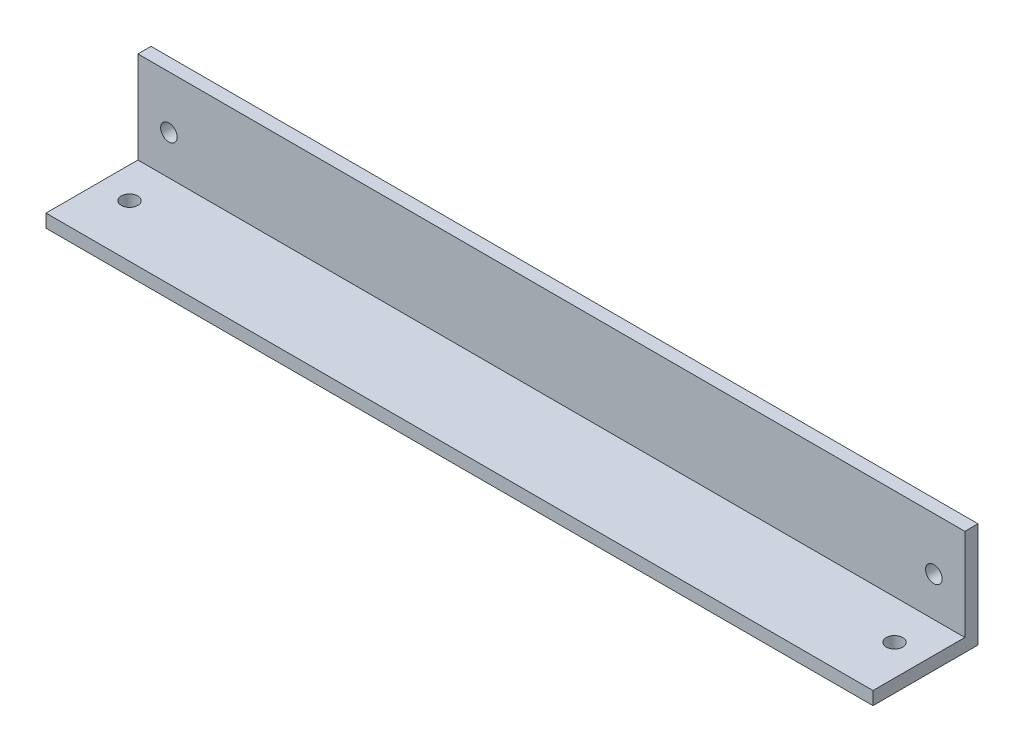
ISO-10303-21;
HEADER;
FILE_DESCRIPTION(('STEP AP214'),'2;1');
FILE_NAME('part.step','',(''),(''),'','','');
FILE_SCHEMA(('AUTOMOTIVE_DESIGN { 1 0 10303 214 1 1 1 1 }'));
ENDSEC;
DATA;
#1=APPLICATION_CONTEXT('core data for automotive mechanical design processes');
#2=APPLICATION_PROTOCOL_DEFINITION('international standard','automotive_design',2000,#1);
#3=PRODUCT_CONTEXT('',#1,'mechanical');
#4=PRODUCT('Part','Part','',(#3));
#5=PRODUCT_RELATED_PRODUCT_CATEGORY('part','',(#4));
#6=PRODUCT_DEFINITION_FORMATION('','',#4);
#7=PRODUCT_DEFINITION_CONTEXT('part definition',#1,'design');
#8=PRODUCT_DEFINITION('design','',#6,#7);
#9=PRODUCT_DEFINITION_SHAPE('','',#8);
#10=(LENGTH_UNIT() NAMED_UNIT(*) SI_UNIT(.MILLI.,.METRE.));
#11=(NAMED_UNIT(*) PLANE_ANGLE_UNIT() SI_UNIT($,.RADIAN.));
#12=(NAMED_UNIT(*) SI_UNIT($,.STERADIAN.) SOLID_ANGLE_UNIT());
#13=UNCERTAINTY_MEASURE_WITH_UNIT(LENGTH_MEASURE(1.E-05),#10,'distance_accuracy_value','');
#14=(GEOMETRIC_REPRESENTATION_CONTEXT(3) GLOBAL_UNCERTAINTY_ASSIGNED_CONTEXT((#13)) GLOBAL_UNIT_ASSIGNED_CONTEXT((#10,
#11,#12)) REPRESENTATION_CONTEXT('',''));
#15=CARTESIAN_POINT('',(0.,0.,0.));
#16=DIRECTION('',(0.,0.,1.));
#17=DIRECTION('',(1.,0.,0.));
#18=AXIS2_PLACEMENT_3D('',#15,#16,#17);
#19=CARTESIAN_POINT('',(200.,6.34999999999999,6.35));
#20=DIRECTION('',(0.,0.,-1.));
#21=DIRECTION('',(0.,1.,0.));
#22=AXIS2_PLACEMENT_3D('',#19,#20,#21);
#23=PLANE('',#22);
#24=CARTESIAN_POINT('',(-185.,25.4,6.35));
#25=DIRECTION('',(0.,0.,-1.));
#26=DIRECTION('',(0.,1.,0.));
#27=AXIS2_PLACEMENT_3D('',#24,#25,#26);
#28=CIRCLE('',#27,3.99999999999999);
#29=CARTESIAN_POINT('',(-185.,29.4,6.35));
#30=VERTEX_POINT('',#29);
#31=EDGE_CURVE('E150',#30,#30,#28,.T.);
#32=ORIENTED_EDGE('',*,*,#31,.T.);
#33=EDGE_LOOP('',(#32));
#34=FACE_BOUND('',#33,.T.);
#35=DIRECTION('',(0.,-1.,0.));
#36=VECTOR('',#35,1.);
#37=CARTESIAN_POINT('',(-200.,6.34999999999999,6.35));
#38=LINE('',#37,#36);
#39=CARTESIAN_POINT('',(-200.,50.8,6.35));
#40=VERTEX_POINT('',#39);
#41=CARTESIAN_POINT('',(-200.,6.34999999999999,6.35));
#42=VERTEX_POINT('',#41);
#43=EDGE_CURVE('E120',#40,#42,#38,.T.);
#44=ORIENTED_EDGE('',*,*,#43,.T.);
#45=DIRECTION('',(-1.,0.,0.));
#46=VECTOR('',#45,1.);
#47=CARTESIAN_POINT('',(200.,6.34999999999999,6.35));
#48=LINE('',#47,#46);
#49=CARTESIAN_POINT('',(200.,6.34999999999999,6.35));
#50=VERTEX_POINT('',#49);
#51=EDGE_CURVE('E41',#50,#42,#48,.T.);
#52=ORIENTED_EDGE('',*,*,#51,.F.);
#53=DIRECTION('',(0.,-1.,0.));
#54=VECTOR('',#53,1.);
#55=CARTESIAN_POINT('',(200.,6.34999999999999,6.35));
#56=LINE('',#55,#54);
#57=CARTESIAN_POINT('',(200.,50.8,6.35));
#58=VERTEX_POINT('',#57);
#59=EDGE_CURVE('E86',#58,#50,#56,.T.);
#60=ORIENTED_EDGE('',*,*,#59,.F.);
#61=DIRECTION('',(-1.,0.,0.));
#62=VECTOR('',#61,1.);
#63=CARTESIAN_POINT('',(200.,50.8,6.35));
#64=LINE('',#63,#62);
#65=EDGE_CURVE('E11',#58,#40,#64,.T.);
#66=ORIENTED_EDGE('',*,*,#65,.T.);
#67=EDGE_LOOP('',(#44,#52,#60,#66));
#68=FACE_BOUND('',#67,.T.);
#69=CARTESIAN_POINT('',(185.,25.4,6.35));
#70=DIRECTION('',(0.,0.,-1.));
#71=DIRECTION('',(0.,1.,0.));
#72=AXIS2_PLACEMENT_3D('',#69,#70,#71);
#73=CIRCLE('',#72,3.99999999999999);
#74=CARTESIAN_POINT('',(185.,29.4,6.35));
#75=VERTEX_POINT('',#74);
#76=EDGE_CURVE('E151',#75,#75,#73,.T.);
#77=ORIENTED_EDGE('',*,*,#76,.T.);
#78=EDGE_LOOP('',(#77));
#79=FACE_BOUND('',#78,.T.);
#80=ADVANCED_FACE('F32',(#34,#68,#79),#23,.F.);
#81=CARTESIAN_POINT('',(200.,50.8,0.));
#82=DIRECTION('',(0.,0.,1.));
#83=DIRECTION('',(1.,0.,0.));
#84=AXIS2_PLACEMENT_3D('',#81,#82,#83);
#85=PLANE('',#84);
#86=CARTESIAN_POINT('',(-185.,25.4,0.));
#87=DIRECTION('',(0.,0.,1.));
#88=DIRECTION('',(0.,-1.,0.));
#89=AXIS2_PLACEMENT_3D('',#86,#87,#88);
#90=CIRCLE('',#89,3.99999999999999);
#91=CARTESIAN_POINT('',(-185.,21.4,0.));
#92=VERTEX_POINT('',#91);
#93=EDGE_CURVE('E154',#92,#92,#90,.T.);
#94=ORIENTED_EDGE('',*,*,#93,.T.);
#95=EDGE_LOOP('',(#94));
#96=FACE_BOUND('',#95,.T.);
#97=DIRECTION('',(0.,1.,0.));
#98=VECTOR('',#97,1.);
#99=CARTESIAN_POINT('',(-200.,50.8,0.));
#100=LINE('',#99,#98);
#101=CARTESIAN_POINT('',(-200.,0.,0.));
#102=VERTEX_POINT('',#101);
#103=CARTESIAN_POINT('',(-200.,50.8,0.));
#104=VERTEX_POINT('',#103);
#105=EDGE_CURVE('E78',#102,#104,#100,.T.);
#106=ORIENTED_EDGE('',*,*,#105,.T.);
#107=DIRECTION('',(-1.,0.,0.));
#108=VECTOR('',#107,1.);
#109=CARTESIAN_POINT('',(200.,50.8,0.));
#110=LINE('',#109,#108);
#111=CARTESIAN_POINT('',(200.,50.8,0.));
#112=VERTEX_POINT('',#111);
#113=EDGE_CURVE('E113',#112,#104,#110,.T.);
#114=ORIENTED_EDGE('',*,*,#113,.F.);
#115=DIRECTION('',(0.,1.,0.));
#116=VECTOR('',#115,1.);
#117=CARTESIAN_POINT('',(200.,50.8,0.));
#118=LINE('',#117,#116);
#119=CARTESIAN_POINT('',(200.,0.,0.));
#120=VERTEX_POINT('',#119);
#121=EDGE_CURVE('E49',#120,#112,#118,.T.);
#122=ORIENTED_EDGE('',*,*,#121,.F.);
#123=DIRECTION('',(-1.,0.,0.));
#124=VECTOR('',#123,1.);
#125=CARTESIAN_POINT('',(200.,0.,0.));
#126=LINE('',#125,#124);
#127=EDGE_CURVE('E109',#120,#102,#126,.T.);
#128=ORIENTED_EDGE('',*,*,#127,.T.);
#129=EDGE_LOOP('',(#106,#114,#122,#128));
#130=FACE_BOUND('',#129,.T.);
#131=CARTESIAN_POINT('',(185.,25.4,0.));
#132=DIRECTION('',(0.,0.,1.));
#133=DIRECTION('',(0.,1.,0.));
#134=AXIS2_PLACEMENT_3D('',#131,#132,#133);
#135=CIRCLE('',#134,3.99999999999999);
#136=CARTESIAN_POINT('',(185.,29.4,0.));
#137=VERTEX_POINT('',#136);
#138=EDGE_CURVE('E148',#137,#137,#135,.T.);
#139=ORIENTED_EDGE('',*,*,#138,.T.);
#140=EDGE_LOOP('',(#139));
#141=FACE_BOUND('',#140,.T.);
#142=ADVANCED_FACE('F141',(#96,#130,#141),#85,.F.);
#143=CARTESIAN_POINT('',(200.,50.8,6.35));
#144=DIRECTION('',(0.,-1.,0.));
#145=DIRECTION('',(0.,0.,-1.));
#146=AXIS2_PLACEMENT_3D('',#143,#144,#145);
#147=PLANE('',#146);
#148=DIRECTION('',(0.,0.,1.));
#149=VECTOR('',#148,1.);
#150=CARTESIAN_POINT('',(-200.,50.8,6.35));
#151=LINE('',#150,#149);
#152=EDGE_CURVE('E117',#104,#40,#151,.T.);
#153=ORIENTED_EDGE('',*,*,#152,.T.);
#154=ORIENTED_EDGE('',*,*,#65,.F.);
#155=DIRECTION('',(0.,0.,1.));
#156=VECTOR('',#155,1.);
#157=CARTESIAN_POINT('',(200.,50.8,6.35));
#158=LINE('',#157,#156);
#159=EDGE_CURVE('E128',#112,#58,#158,.T.);
#160=ORIENTED_EDGE('',*,*,#159,.F.);
#161=ORIENTED_EDGE('',*,*,#113,.T.);
#162=EDGE_LOOP('',(#153,#154,#160,#161));
#163=FACE_BOUND('',#162,.T.);
#164=ADVANCED_FACE('F34',(#163),#147,.F.);
#165=CARTESIAN_POINT('',(200.,6.34999999999999,50.8));
#166=DIRECTION('',(0.,-1.,0.));
#167=DIRECTION('',(0.,0.,-1.));
#168=AXIS2_PLACEMENT_3D('',#165,#166,#167);
#169=PLANE('',#168);
#170=CARTESIAN_POINT('',(185.,6.34999999999999,25.4));
#171=DIRECTION('',(0.,-1.,0.));
#172=DIRECTION('',(0.,0.,-1.));
#173=AXIS2_PLACEMENT_3D('',#170,#171,#172);
#174=CIRCLE('',#173,3.99999999999999);
#175=CARTESIAN_POINT('',(185.,6.34999999999999,21.4000000000001));
#176=VERTEX_POINT('',#175);
#177=EDGE_CURVE('E164',#176,#176,#174,.F.);
#178=ORIENTED_EDGE('',*,*,#177,.F.);
#179=EDGE_LOOP('',(#178));
#180=FACE_BOUND('',#179,.T.);
#181=CARTESIAN_POINT('',(-185.,6.34999999999999,25.4));
#182=DIRECTION('',(0.,-1.,0.));
#183=DIRECTION('',(0.,0.,-1.));
#184=AXIS2_PLACEMENT_3D('',#181,#182,#183);
#185=CIRCLE('',#184,3.99999999999999);
#186=CARTESIAN_POINT('',(-185.,6.34999999999999,21.4));
#187=VERTEX_POINT('',#186);
#188=EDGE_CURVE('E121',#187,#187,#185,.F.);
#189=ORIENTED_EDGE('',*,*,#188,.F.);
#190=EDGE_LOOP('',(#189));
#191=FACE_BOUND('',#190,.T.);
#192=DIRECTION('',(0.,0.,1.));
#193=VECTOR('',#192,1.);
#194=CARTESIAN_POINT('',(-200.,6.34999999999999,50.8));
#195=LINE('',#194,#193);
#196=CARTESIAN_POINT('',(-200.,6.34999999999999,50.8));
#197=VERTEX_POINT('',#196);
#198=EDGE_CURVE('E123',#42,#197,#195,.T.);
#199=ORIENTED_EDGE('',*,*,#198,.T.);
#200=DIRECTION('',(-1.,0.,0.));
#201=VECTOR('',#200,1.);
#202=CARTESIAN_POINT('',(200.,6.34999999999999,50.8));
#203=LINE('',#202,#201);
#204=CARTESIAN_POINT('',(200.,6.34999999999999,50.8));
#205=VERTEX_POINT('',#204);
#206=EDGE_CURVE('E108',#205,#197,#203,.T.);
#207=ORIENTED_EDGE('',*,*,#206,.F.);
#208=DIRECTION('',(0.,0.,1.));
#209=VECTOR('',#208,1.);
#210=CARTESIAN_POINT('',(200.,6.34999999999999,50.8));
#211=LINE('',#210,#209);
#212=EDGE_CURVE('E99',#50,#205,#211,.T.);
#213=ORIENTED_EDGE('',*,*,#212,.F.);
#214=ORIENTED_EDGE('',*,*,#51,.T.);
#215=EDGE_LOOP('',(#199,#207,#213,#214));
#216=FACE_BOUND('',#215,.T.);
#217=ADVANCED_FACE('F134',(#180,#191,#216),#169,.F.);
#218=CARTESIAN_POINT('',(200.,0.,50.8));
#219=DIRECTION('',(0.,0.,-1.));
#220=DIRECTION('',(-1.,0.,0.));
#221=AXIS2_PLACEMENT_3D('',#218,#219,#220);
#222=PLANE('',#221);
#223=DIRECTION('',(0.,-1.,0.));
#224=VECTOR('',#223,1.);
#225=CARTESIAN_POINT('',(-200.,0.,50.8));
#226=LINE('',#225,#224);
#227=CARTESIAN_POINT('',(-200.,0.,50.8));
#228=VERTEX_POINT('',#227);
#229=EDGE_CURVE('E107',#197,#228,#226,.T.);
#230=ORIENTED_EDGE('',*,*,#229,.T.);
#231=DIRECTION('',(-1.,0.,0.));
#232=VECTOR('',#231,1.);
#233=CARTESIAN_POINT('',(200.,0.,50.8));
#234=LINE('',#233,#232);
#235=CARTESIAN_POINT('',(200.,0.,50.8));
#236=VERTEX_POINT('',#235);
#237=EDGE_CURVE('E104',#236,#228,#234,.T.);
#238=ORIENTED_EDGE('',*,*,#237,.F.);
#239=DIRECTION('',(0.,-1.,0.));
#240=VECTOR('',#239,1.);
#241=CARTESIAN_POINT('',(200.,0.,50.8));
#242=LINE('',#241,#240);
#243=EDGE_CURVE('E93',#205,#236,#242,.T.);
#244=ORIENTED_EDGE('',*,*,#243,.F.);
#245=ORIENTED_EDGE('',*,*,#206,.T.);
#246=EDGE_LOOP('',(#230,#238,#244,#245));
#247=FACE_BOUND('',#246,.T.);
#248=ADVANCED_FACE('F105',(#247),#222,.F.);
#249=CARTESIAN_POINT('',(200.,0.,0.));
#250=DIRECTION('',(0.,1.,0.));
#251=DIRECTION('',(0.,0.,1.));
#252=AXIS2_PLACEMENT_3D('',#249,#250,#251);
#253=PLANE('',#252);
#254=CARTESIAN_POINT('',(185.,0.,25.4));
#255=DIRECTION('',(0.,-1.,0.));
#256=DIRECTION('',(0.,0.,1.));
#257=AXIS2_PLACEMENT_3D('',#254,#255,#256);
#258=CIRCLE('',#257,3.99999999999999);
#259=CARTESIAN_POINT('',(185.,0.,29.4));
#260=VERTEX_POINT('',#259);
#261=EDGE_CURVE('E160',#260,#260,#258,.T.);
#262=ORIENTED_EDGE('',*,*,#261,.F.);
#263=EDGE_LOOP('',(#262));
#264=FACE_BOUND('',#263,.T.);
#265=CARTESIAN_POINT('',(-185.,0.,25.4));
#266=DIRECTION('',(0.,-1.,0.));
#267=DIRECTION('',(0.,0.,-1.));
#268=AXIS2_PLACEMENT_3D('',#265,#266,#267);
#269=CIRCLE('',#268,3.99999999999999);
#270=CARTESIAN_POINT('',(-185.,0.,21.4));
#271=VERTEX_POINT('',#270);
#272=EDGE_CURVE('E167',#271,#271,#269,.T.);
#273=ORIENTED_EDGE('',*,*,#272,.F.);
#274=EDGE_LOOP('',(#273));
#275=FACE_BOUND('',#274,.T.);
#276=DIRECTION('',(0.,0.,-1.));
#277=VECTOR('',#276,1.);
#278=CARTESIAN_POINT('',(-200.,0.,0.));
#279=LINE('',#278,#277);
#280=EDGE_CURVE('E72',#228,#102,#279,.T.);
#281=ORIENTED_EDGE('',*,*,#280,.T.);
#282=ORIENTED_EDGE('',*,*,#127,.F.);
#283=DIRECTION('',(0.,0.,-1.));
#284=VECTOR('',#283,1.);
#285=CARTESIAN_POINT('',(200.,0.,0.));
#286=LINE('',#285,#284);
#287=EDGE_CURVE('E97',#236,#120,#286,.T.);
#288=ORIENTED_EDGE('',*,*,#287,.F.);
#289=ORIENTED_EDGE('',*,*,#237,.T.);
#290=EDGE_LOOP('',(#281,#282,#288,#289));
#291=FACE_BOUND('',#290,.T.);
#292=ADVANCED_FACE('F111',(#264,#275,#291),#253,.F.);
#293=CARTESIAN_POINT('',(200.,0.,0.));
#294=DIRECTION('',(-1.,0.,0.));
#295=DIRECTION('',(0.,0.,1.));
#296=AXIS2_PLACEMENT_3D('',#293,#294,#295);
#297=PLANE('',#296);
#298=ORIENTED_EDGE('',*,*,#159,.T.);
#299=ORIENTED_EDGE('',*,*,#59,.T.);
#300=ORIENTED_EDGE('',*,*,#212,.T.);
#301=ORIENTED_EDGE('',*,*,#243,.T.);
#302=ORIENTED_EDGE('',*,*,#287,.T.);
#303=ORIENTED_EDGE('',*,*,#121,.T.);
#304=EDGE_LOOP('',(#298,#299,#300,#301,#302,#303));
#305=FACE_BOUND('',#304,.T.);
#306=ADVANCED_FACE('F95',(#305),#297,.F.);
#307=CARTESIAN_POINT('',(-200.,0.,0.));
#308=DIRECTION('',(-1.,0.,0.));
#309=DIRECTION('',(0.,0.,1.));
#310=AXIS2_PLACEMENT_3D('',#307,#308,#309);
#311=PLANE('',#310);
#312=ORIENTED_EDGE('',*,*,#152,.F.);
#313=ORIENTED_EDGE('',*,*,#105,.F.);
#314=ORIENTED_EDGE('',*,*,#280,.F.);
#315=ORIENTED_EDGE('',*,*,#229,.F.);
#316=ORIENTED_EDGE('',*,*,#198,.F.);
#317=ORIENTED_EDGE('',*,*,#43,.F.);
#318=EDGE_LOOP('',(#312,#313,#314,#315,#316,#317));
#319=FACE_BOUND('',#318,.T.);
#320=ADVANCED_FACE('F137',(#319),#311,.T.);
#321=CARTESIAN_POINT('',(-185.,50.801,25.4));
#322=DIRECTION('',(0.,-1.,0.));
#323=DIRECTION('',(0.,0.,-1.));
#324=AXIS2_PLACEMENT_3D('',#321,#322,#323);
#325=CYLINDRICAL_SURFACE('',#324,3.99999999999999);
#326=ORIENTED_EDGE('',*,*,#272,.T.);
#327=EDGE_LOOP('',(#326));
#328=FACE_BOUND('',#327,.T.);
#329=ORIENTED_EDGE('',*,*,#188,.T.);
#330=EDGE_LOOP('',(#329));
#331=FACE_BOUND('',#330,.T.);
#332=ADVANCED_FACE('F175',(#328,#331),#325,.F.);
#333=CARTESIAN_POINT('',(185.,50.801,25.4000000000001));
#334=DIRECTION('',(0.,-1.,0.));
#335=DIRECTION('',(0.,0.,-1.));
#336=AXIS2_PLACEMENT_3D('',#333,#334,#335);
#337=CYLINDRICAL_SURFACE('',#336,3.99999999999999);
#338=ORIENTED_EDGE('',*,*,#261,.T.);
#339=EDGE_LOOP('',(#338));
#340=FACE_BOUND('',#339,.T.);
#341=ORIENTED_EDGE('',*,*,#177,.T.);
#342=EDGE_LOOP('',(#341));
#343=FACE_BOUND('',#342,.T.);
#344=ADVANCED_FACE('F201',(#340,#343),#337,.F.);
#345=CARTESIAN_POINT('',(-185.,25.3999999999999,50.801));
#346=DIRECTION('',(0.,0.,-1.));
#347=DIRECTION('',(0.,1.,0.));
#348=AXIS2_PLACEMENT_3D('',#345,#346,#347);
#349=CYLINDRICAL_SURFACE('',#348,3.99999999999999);
#350=ORIENTED_EDGE('',*,*,#93,.F.);
#351=EDGE_LOOP('',(#350));
#352=FACE_BOUND('',#351,.T.);
#353=ORIENTED_EDGE('',*,*,#31,.F.);
#354=EDGE_LOOP('',(#353));
#355=FACE_BOUND('',#354,.T.);
#356=ADVANCED_FACE('F196',(#352,#355),#349,.F.);
#357=CARTESIAN_POINT('',(185.,25.4,50.801));
#358=DIRECTION('',(0.,0.,-1.));
#359=DIRECTION('',(0.,1.,0.));
#360=AXIS2_PLACEMENT_3D('',#357,#358,#359);
#361=CYLINDRICAL_SURFACE('',#360,3.99999999999999);
#362=ORIENTED_EDGE('',*,*,#138,.F.);
#363=EDGE_LOOP('',(#362));
#364=FACE_BOUND('',#363,.T.);
#365=ORIENTED_EDGE('',*,*,#76,.F.);
#366=EDGE_LOOP('',(#365));
#367=FACE_BOUND('',#366,.T.);
#368=ADVANCED_FACE('F194',(#364,#367),#361,.F.);
#369=CLOSED_SHELL('',(#80,#142,#164,#217,#248,#292,#306,#320,#332,#344,#356,#368));
#370=MANIFOLD_SOLID_BREP('B2',#369);
#371=ADVANCED_BREP_SHAPE_REPRESENTATION('',(#18,#370),#14);
#372=SHAPE_DEFINITION_REPRESENTATION(#9,#371);
ENDSEC;
END-ISO-10303-21;
